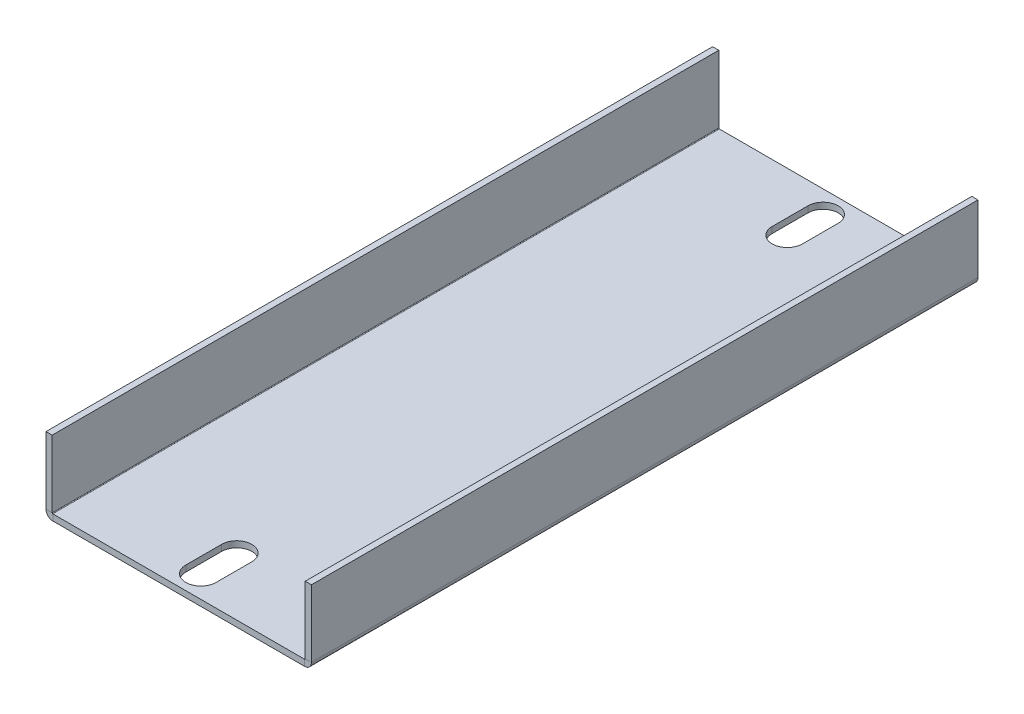
ISO-10303-21;
HEADER;
FILE_DESCRIPTION(('STEP AP214'),'2;1');
FILE_NAME('part.step','',(''),(''),'','','');
FILE_SCHEMA(('AUTOMOTIVE_DESIGN { 1 0 10303 214 1 1 1 1 }'));
ENDSEC;
DATA;
#1=APPLICATION_CONTEXT('core data for automotive mechanical design processes');
#2=APPLICATION_PROTOCOL_DEFINITION('international standard','automotive_design',2000,#1);
#3=PRODUCT_CONTEXT('',#1,'mechanical');
#4=PRODUCT('Part','Part','',(#3));
#5=PRODUCT_RELATED_PRODUCT_CATEGORY('part','',(#4));
#6=PRODUCT_DEFINITION_FORMATION('','',#4);
#7=PRODUCT_DEFINITION_CONTEXT('part definition',#1,'design');
#8=PRODUCT_DEFINITION('design','',#6,#7);
#9=PRODUCT_DEFINITION_SHAPE('','',#8);
#10=(LENGTH_UNIT() NAMED_UNIT(*) SI_UNIT(.MILLI.,.METRE.));
#11=(NAMED_UNIT(*) PLANE_ANGLE_UNIT() SI_UNIT($,.RADIAN.));
#12=(NAMED_UNIT(*) SI_UNIT($,.STERADIAN.) SOLID_ANGLE_UNIT());
#13=UNCERTAINTY_MEASURE_WITH_UNIT(LENGTH_MEASURE(1.E-05),#10,'distance_accuracy_value','');
#14=(GEOMETRIC_REPRESENTATION_CONTEXT(3) GLOBAL_UNCERTAINTY_ASSIGNED_CONTEXT((#13)) GLOBAL_UNIT_ASSIGNED_CONTEXT((#10,
#11,#12)) REPRESENTATION_CONTEXT('',''));
#15=CARTESIAN_POINT('',(0.,0.,0.));
#16=DIRECTION('',(0.,0.,1.));
#17=DIRECTION('',(1.,0.,0.));
#18=AXIS2_PLACEMENT_3D('',#15,#16,#17);
#19=CARTESIAN_POINT('',(-173.097305372499,-0.999999999999994,-11.0415945787923));
#20=DIRECTION('',(0.,1.,0.));
#21=DIRECTION('',(-1.,0.,0.));
#22=AXIS2_PLACEMENT_3D('',#19,#20,#21);
#23=PLANE('',#22);
#24=DIRECTION('',(0.,0.,1.));
#25=VECTOR('',#24,1.);
#26=CARTESIAN_POINT('',(44.,-0.999999999999994,-11.0415945787923));
#27=LINE('',#26,#25);
#28=CARTESIAN_POINT('',(44.,-0.999999999999994,1.));
#29=VERTEX_POINT('',#28);
#30=CARTESIAN_POINT('',(44.,-0.999999999999994,109.));
#31=VERTEX_POINT('',#30);
#32=EDGE_CURVE('E296',#29,#31,#27,.T.);
#33=ORIENTED_EDGE('',*,*,#32,.F.);
#34=DIRECTION('',(1.,0.,0.));
#35=VECTOR('',#34,1.);
#36=CARTESIAN_POINT('',(-173.097305372499,-0.999999999999994,1.));
#37=LINE('',#36,#35);
#38=CARTESIAN_POINT('',(43.,-0.999999999999994,1.));
#39=VERTEX_POINT('',#38);
#40=EDGE_CURVE('E12',#39,#29,#37,.T.);
#41=ORIENTED_EDGE('',*,*,#40,.F.);
#42=DIRECTION('',(0.,0.,1.));
#43=VECTOR('',#42,1.);
#44=CARTESIAN_POINT('',(43.,-0.999999999999994,-11.0415945787923));
#45=LINE('',#44,#43);
#46=CARTESIAN_POINT('',(43.,-0.999999999999994,109.));
#47=VERTEX_POINT('',#46);
#48=EDGE_CURVE('E79',#39,#47,#45,.T.);
#49=ORIENTED_EDGE('',*,*,#48,.T.);
#50=DIRECTION('',(1.,0.,0.));
#51=VECTOR('',#50,1.);
#52=CARTESIAN_POINT('',(-173.097305372499,-0.999999999999994,109.));
#53=LINE('',#52,#51);
#54=EDGE_CURVE('E298',#47,#31,#53,.T.);
#55=ORIENTED_EDGE('',*,*,#54,.T.);
#56=EDGE_LOOP('',(#33,#41,#49,#55));
#57=FACE_BOUND('',#56,.T.);
#58=ADVANCED_FACE('F53',(#57),#23,.T.);
#59=CARTESIAN_POINT('',(-173.097305372499,-13.,109.));
#60=DIRECTION('',(0.,0.,1.));
#61=DIRECTION('',(0.,1.,0.));
#62=AXIS2_PLACEMENT_3D('',#59,#60,#61);
#63=PLANE('',#62);
#64=DIRECTION('',(0.,1.,0.));
#65=VECTOR('',#64,1.);
#66=CARTESIAN_POINT('',(44.,-13.,109.));
#67=LINE('',#66,#65);
#68=CARTESIAN_POINT('',(44.,-11.9,109.));
#69=VERTEX_POINT('',#68);
#70=EDGE_CURVE('E107',#69,#31,#67,.T.);
#71=ORIENTED_EDGE('',*,*,#70,.T.);
#72=ORIENTED_EDGE('',*,*,#54,.F.);
#73=DIRECTION('',(0.,-1.,0.));
#74=VECTOR('',#73,1.);
#75=CARTESIAN_POINT('',(43.,-13.,109.));
#76=LINE('',#75,#74);
#77=CARTESIAN_POINT('',(43.,-11.9,109.));
#78=VERTEX_POINT('',#77);
#79=EDGE_CURVE('E289',#47,#78,#76,.T.);
#80=ORIENTED_EDGE('',*,*,#79,.T.);
#81=DIRECTION('',(1.,0.,0.));
#82=VECTOR('',#81,1.);
#83=CARTESIAN_POINT('',(-173.097305372499,-11.9,109.));
#84=LINE('',#83,#82);
#85=EDGE_CURVE('E278',#78,#69,#84,.T.);
#86=ORIENTED_EDGE('',*,*,#85,.T.);
#87=EDGE_LOOP('',(#71,#72,#80,#86));
#88=FACE_BOUND('',#87,.T.);
#89=ADVANCED_FACE('F288',(#88),#63,.T.);
#90=CARTESIAN_POINT('',(44.,-13.,109.));
#91=DIRECTION('',(-1.,0.,0.));
#92=DIRECTION('',(0.,0.,1.));
#93=AXIS2_PLACEMENT_3D('',#90,#91,#92);
#94=PLANE('',#93);
#95=ORIENTED_EDGE('',*,*,#70,.F.);
#96=DIRECTION('',(0.,0.,-1.));
#97=VECTOR('',#96,1.);
#98=CARTESIAN_POINT('',(44.,-11.9,109.));
#99=LINE('',#98,#97);
#100=CARTESIAN_POINT('',(44.,-11.9,1.));
#101=VERTEX_POINT('',#100);
#102=EDGE_CURVE('E268',#69,#101,#99,.T.);
#103=ORIENTED_EDGE('',*,*,#102,.T.);
#104=DIRECTION('',(0.,1.,0.));
#105=VECTOR('',#104,1.);
#106=CARTESIAN_POINT('',(44.,-13.,1.));
#107=LINE('',#106,#105);
#108=EDGE_CURVE('E277',#101,#29,#107,.T.);
#109=ORIENTED_EDGE('',*,*,#108,.T.);
#110=ORIENTED_EDGE('',*,*,#32,.T.);
#111=EDGE_LOOP('',(#95,#103,#109,#110));
#112=FACE_BOUND('',#111,.T.);
#113=ADVANCED_FACE('F294',(#112),#94,.F.);
#114=CARTESIAN_POINT('',(-173.097305372499,-13.,1.));
#115=DIRECTION('',(0.,0.,-1.));
#116=DIRECTION('',(0.,-1.,0.));
#117=AXIS2_PLACEMENT_3D('',#114,#115,#116);
#118=PLANE('',#117);
#119=ORIENTED_EDGE('',*,*,#108,.F.);
#120=DIRECTION('',(1.,0.,0.));
#121=VECTOR('',#120,1.);
#122=CARTESIAN_POINT('',(-173.097305372499,-11.9,1.));
#123=LINE('',#122,#121);
#124=CARTESIAN_POINT('',(43.,-11.9,1.));
#125=VERTEX_POINT('',#124);
#126=EDGE_CURVE('E407',#125,#101,#123,.T.);
#127=ORIENTED_EDGE('',*,*,#126,.F.);
#128=DIRECTION('',(0.,1.,0.));
#129=VECTOR('',#128,1.);
#130=CARTESIAN_POINT('',(43.,-13.,1.));
#131=LINE('',#130,#129);
#132=EDGE_CURVE('E66',#125,#39,#131,.T.);
#133=ORIENTED_EDGE('',*,*,#132,.T.);
#134=ORIENTED_EDGE('',*,*,#40,.T.);
#135=EDGE_LOOP('',(#119,#127,#133,#134));
#136=FACE_BOUND('',#135,.T.);
#137=ADVANCED_FACE('F414',(#136),#118,.T.);
#138=CARTESIAN_POINT('',(43.,-13.,-11.0415945787923));
#139=DIRECTION('',(-1.,0.,0.));
#140=DIRECTION('',(0.,0.,1.));
#141=AXIS2_PLACEMENT_3D('',#138,#139,#140);
#142=PLANE('',#141);
#143=DIRECTION('',(0.,0.,-1.));
#144=VECTOR('',#143,1.);
#145=CARTESIAN_POINT('',(43.,-11.9,109.));
#146=LINE('',#145,#144);
#147=EDGE_CURVE('E58',#78,#125,#146,.T.);
#148=ORIENTED_EDGE('',*,*,#147,.F.);
#149=ORIENTED_EDGE('',*,*,#79,.F.);
#150=ORIENTED_EDGE('',*,*,#48,.F.);
#151=ORIENTED_EDGE('',*,*,#132,.F.);
#152=EDGE_LOOP('',(#148,#149,#150,#151));
#153=FACE_BOUND('',#152,.T.);
#154=ADVANCED_FACE('F56',(#153),#142,.T.);
#155=CARTESIAN_POINT('',(218.097305372499,-1.,-11.0415945787923));
#156=DIRECTION('',(0.,-1.,0.));
#157=DIRECTION('',(1.,0.,0.));
#158=AXIS2_PLACEMENT_3D('',#155,#156,#157);
#159=PLANE('',#158);
#160=DIRECTION('',(-1.,0.,0.));
#161=VECTOR('',#160,1.);
#162=CARTESIAN_POINT('',(218.097305372499,-1.,1.));
#163=LINE('',#162,#161);
#164=CARTESIAN_POINT('',(1.99999999999998,-1.,1.));
#165=VERTEX_POINT('',#164);
#166=CARTESIAN_POINT('',(0.999999999999973,-1.,1.));
#167=VERTEX_POINT('',#166);
#168=EDGE_CURVE('E623',#165,#167,#163,.T.);
#169=ORIENTED_EDGE('',*,*,#168,.T.);
#170=DIRECTION('',(0.,0.,1.));
#171=VECTOR('',#170,1.);
#172=CARTESIAN_POINT('',(0.999999999999985,-1.,-11.0415945787923));
#173=LINE('',#172,#171);
#174=CARTESIAN_POINT('',(0.999999999999985,-0.999999999999999,109.));
#175=VERTEX_POINT('',#174);
#176=EDGE_CURVE('E379',#167,#175,#173,.T.);
#177=ORIENTED_EDGE('',*,*,#176,.T.);
#178=DIRECTION('',(-1.,0.,0.));
#179=VECTOR('',#178,1.);
#180=CARTESIAN_POINT('',(218.097305372499,-0.999999999999999,109.));
#181=LINE('',#180,#179);
#182=CARTESIAN_POINT('',(1.99999999999997,-0.999999999999997,109.));
#183=VERTEX_POINT('',#182);
#184=EDGE_CURVE('E420',#183,#175,#181,.T.);
#185=ORIENTED_EDGE('',*,*,#184,.F.);
#186=DIRECTION('',(0.,0.,1.));
#187=VECTOR('',#186,1.);
#188=CARTESIAN_POINT('',(1.99999999999998,-1.,-11.0415945787923));
#189=LINE('',#188,#187);
#190=EDGE_CURVE('E120',#165,#183,#189,.T.);
#191=ORIENTED_EDGE('',*,*,#190,.F.);
#192=EDGE_LOOP('',(#169,#177,#185,#191));
#193=FACE_BOUND('',#192,.T.);
#194=ADVANCED_FACE('F663',(#193),#159,.F.);
#195=CARTESIAN_POINT('',(218.097305372499,-13.,1.));
#196=DIRECTION('',(0.,0.,-1.));
#197=DIRECTION('',(0.,1.,0.));
#198=AXIS2_PLACEMENT_3D('',#195,#196,#197);
#199=PLANE('',#198);
#200=DIRECTION('',(0.,1.,0.));
#201=VECTOR('',#200,1.);
#202=CARTESIAN_POINT('',(0.999999999999984,-13.,1.));
#203=LINE('',#202,#201);
#204=CARTESIAN_POINT('',(0.999999999999982,-11.9000000000001,1.));
#205=VERTEX_POINT('',#204);
#206=EDGE_CURVE('E148',#205,#167,#203,.T.);
#207=ORIENTED_EDGE('',*,*,#206,.T.);
#208=ORIENTED_EDGE('',*,*,#168,.F.);
#209=DIRECTION('',(0.,-1.,0.));
#210=VECTOR('',#209,1.);
#211=CARTESIAN_POINT('',(1.99999999999998,-13.,1.));
#212=LINE('',#211,#210);
#213=CARTESIAN_POINT('',(1.99999999999998,-11.9,1.));
#214=VERTEX_POINT('',#213);
#215=EDGE_CURVE('E369',#165,#214,#212,.T.);
#216=ORIENTED_EDGE('',*,*,#215,.T.);
#217=DIRECTION('',(-1.,0.,0.));
#218=VECTOR('',#217,1.);
#219=CARTESIAN_POINT('',(218.097305372499,-11.9,1.));
#220=LINE('',#219,#218);
#221=EDGE_CURVE('E375',#214,#205,#220,.T.);
#222=ORIENTED_EDGE('',*,*,#221,.T.);
#223=EDGE_LOOP('',(#207,#208,#216,#222));
#224=FACE_BOUND('',#223,.T.);
#225=ADVANCED_FACE('F655',(#224),#199,.T.);
#226=CARTESIAN_POINT('',(0.999999999999984,-13.,109.));
#227=DIRECTION('',(1.,0.,0.));
#228=DIRECTION('',(0.,0.,-1.));
#229=AXIS2_PLACEMENT_3D('',#226,#227,#228);
#230=PLANE('',#229);
#231=ORIENTED_EDGE('',*,*,#206,.F.);
#232=DIRECTION('',(0.,0.,1.));
#233=VECTOR('',#232,1.);
#234=CARTESIAN_POINT('',(0.999999999999973,-11.9,1.));
#235=LINE('',#234,#233);
#236=CARTESIAN_POINT('',(0.999999999999984,-11.9,109.));
#237=VERTEX_POINT('',#236);
#238=EDGE_CURVE('E390',#205,#237,#235,.T.);
#239=ORIENTED_EDGE('',*,*,#238,.T.);
#240=DIRECTION('',(0.,1.,0.));
#241=VECTOR('',#240,1.);
#242=CARTESIAN_POINT('',(0.999999999999973,-13.,109.));
#243=LINE('',#242,#241);
#244=EDGE_CURVE('E384',#237,#175,#243,.T.);
#245=ORIENTED_EDGE('',*,*,#244,.T.);
#246=ORIENTED_EDGE('',*,*,#176,.F.);
#247=EDGE_LOOP('',(#231,#239,#245,#246));
#248=FACE_BOUND('',#247,.T.);
#249=ADVANCED_FACE('F659',(#248),#230,.F.);
#250=CARTESIAN_POINT('',(218.097305372499,-13.,109.));
#251=DIRECTION('',(0.,0.,1.));
#252=DIRECTION('',(0.,-1.,0.));
#253=AXIS2_PLACEMENT_3D('',#250,#251,#252);
#254=PLANE('',#253);
#255=ORIENTED_EDGE('',*,*,#244,.F.);
#256=DIRECTION('',(-1.,0.,0.));
#257=VECTOR('',#256,1.);
#258=CARTESIAN_POINT('',(218.097305372499,-11.9,109.));
#259=LINE('',#258,#257);
#260=CARTESIAN_POINT('',(1.99999999999998,-11.9,109.));
#261=VERTEX_POINT('',#260);
#262=EDGE_CURVE('E356',#261,#237,#259,.T.);
#263=ORIENTED_EDGE('',*,*,#262,.F.);
#264=DIRECTION('',(0.,1.,0.));
#265=VECTOR('',#264,1.);
#266=CARTESIAN_POINT('',(1.99999999999997,-13.,109.));
#267=LINE('',#266,#265);
#268=EDGE_CURVE('E389',#261,#183,#267,.T.);
#269=ORIENTED_EDGE('',*,*,#268,.T.);
#270=ORIENTED_EDGE('',*,*,#184,.T.);
#271=EDGE_LOOP('',(#255,#263,#269,#270));
#272=FACE_BOUND('',#271,.T.);
#273=ADVANCED_FACE('F665',(#272),#254,.T.);
#274=CARTESIAN_POINT('',(1.99999999999998,-13.,-11.0415945787923));
#275=DIRECTION('',(1.,0.,0.));
#276=DIRECTION('',(0.,0.,-1.));
#277=AXIS2_PLACEMENT_3D('',#274,#275,#276);
#278=PLANE('',#277);
#279=DIRECTION('',(0.,0.,1.));
#280=VECTOR('',#279,1.);
#281=CARTESIAN_POINT('',(1.99999999999997,-11.9,1.));
#282=LINE('',#281,#280);
#283=EDGE_CURVE('E352',#214,#261,#282,.T.);
#284=ORIENTED_EDGE('',*,*,#283,.F.);
#285=ORIENTED_EDGE('',*,*,#215,.F.);
#286=ORIENTED_EDGE('',*,*,#190,.T.);
#287=ORIENTED_EDGE('',*,*,#268,.F.);
#288=EDGE_LOOP('',(#284,#285,#286,#287));
#289=FACE_BOUND('',#288,.T.);
#290=ADVANCED_FACE('F667',(#289),#278,.T.);
#291=CARTESIAN_POINT('',(0.,-13.,0.));
#292=DIRECTION('',(0.,1.,0.));
#293=DIRECTION('',(0.,0.,1.));
#294=AXIS2_PLACEMENT_3D('',#291,#292,#293);
#295=PLANE('',#294);
#296=CARTESIAN_POINT('',(22.5,-13.,4.6));
#297=DIRECTION('',(0.,-1.,0.));
#298=DIRECTION('',(0.,0.,-1.));
#299=AXIS2_PLACEMENT_3D('',#296,#297,#298);
#300=CIRCLE('',#299,2.45);
#301=CARTESIAN_POINT('',(20.05,-13.,4.6));
#302=VERTEX_POINT('',#301);
#303=CARTESIAN_POINT('',(24.95,-13.,4.60000000000001));
#304=VERTEX_POINT('',#303);
#305=EDGE_CURVE('E505',#302,#304,#300,.T.);
#306=ORIENTED_EDGE('',*,*,#305,.F.);
#307=DIRECTION('',(0.,0.,-1.));
#308=VECTOR('',#307,1.);
#309=CARTESIAN_POINT('',(20.05,-13.,4.6));
#310=LINE('',#309,#308);
#311=CARTESIAN_POINT('',(20.05,-13.,10.4));
#312=VERTEX_POINT('',#311);
#313=EDGE_CURVE('E512',#312,#302,#310,.T.);
#314=ORIENTED_EDGE('',*,*,#313,.F.);
#315=CARTESIAN_POINT('',(22.5,-13.,10.4));
#316=DIRECTION('',(0.,-1.,0.));
#317=DIRECTION('',(0.,0.,-1.));
#318=AXIS2_PLACEMENT_3D('',#315,#316,#317);
#319=CIRCLE('',#318,2.45);
#320=CARTESIAN_POINT('',(24.95,-13.,10.4));
#321=VERTEX_POINT('',#320);
#322=EDGE_CURVE('E526',#321,#312,#319,.T.);
#323=ORIENTED_EDGE('',*,*,#322,.F.);
#324=DIRECTION('',(0.,0.,1.));
#325=VECTOR('',#324,1.);
#326=CARTESIAN_POINT('',(24.95,-13.,4.60000000000001));
#327=LINE('',#326,#325);
#328=EDGE_CURVE('E500',#304,#321,#327,.T.);
#329=ORIENTED_EDGE('',*,*,#328,.F.);
#330=EDGE_LOOP('',(#306,#314,#323,#329));
#331=FACE_BOUND('',#330,.T.);
#332=CARTESIAN_POINT('',(22.5,-13.,105.4));
#333=DIRECTION('',(0.,-1.,0.));
#334=DIRECTION('',(0.,0.,1.));
#335=AXIS2_PLACEMENT_3D('',#332,#333,#334);
#336=CIRCLE('',#335,2.45);
#337=CARTESIAN_POINT('',(24.95,-13.,105.4));
#338=VERTEX_POINT('',#337);
#339=CARTESIAN_POINT('',(20.05,-13.,105.4));
#340=VERTEX_POINT('',#339);
#341=EDGE_CURVE('E486',#338,#340,#336,.T.);
#342=ORIENTED_EDGE('',*,*,#341,.F.);
#343=DIRECTION('',(0.,0.,1.));
#344=VECTOR('',#343,1.);
#345=CARTESIAN_POINT('',(24.95,-13.,105.4));
#346=LINE('',#345,#344);
#347=CARTESIAN_POINT('',(24.95,-13.,99.6));
#348=VERTEX_POINT('',#347);
#349=EDGE_CURVE('E492',#348,#338,#346,.T.);
#350=ORIENTED_EDGE('',*,*,#349,.F.);
#351=CARTESIAN_POINT('',(22.5,-13.,99.6));
#352=DIRECTION('',(0.,-1.,0.));
#353=DIRECTION('',(0.,0.,1.));
#354=AXIS2_PLACEMENT_3D('',#351,#352,#353);
#355=CIRCLE('',#354,2.45);
#356=CARTESIAN_POINT('',(20.05,-13.,99.6));
#357=VERTEX_POINT('',#356);
#358=EDGE_CURVE('E470',#357,#348,#355,.T.);
#359=ORIENTED_EDGE('',*,*,#358,.F.);
#360=DIRECTION('',(0.,0.,-1.));
#361=VECTOR('',#360,1.);
#362=CARTESIAN_POINT('',(20.05,-13.,105.4));
#363=LINE('',#362,#361);
#364=EDGE_CURVE('E465',#340,#357,#363,.T.);
#365=ORIENTED_EDGE('',*,*,#364,.F.);
#366=EDGE_LOOP('',(#342,#350,#359,#365));
#367=FACE_BOUND('',#366,.T.);
#368=DIRECTION('',(0.,0.,-1.));
#369=VECTOR('',#368,1.);
#370=CARTESIAN_POINT('',(42.9,-13.,109.));
#371=LINE('',#370,#369);
#372=CARTESIAN_POINT('',(42.9,-13.,109.));
#373=VERTEX_POINT('',#372);
#374=CARTESIAN_POINT('',(42.9,-13.,1.));
#375=VERTEX_POINT('',#374);
#376=EDGE_CURVE('E441',#373,#375,#371,.T.);
#377=ORIENTED_EDGE('',*,*,#376,.F.);
#378=DIRECTION('',(-1.,0.,0.));
#379=VECTOR('',#378,1.);
#380=CARTESIAN_POINT('',(44.,-13.,109.));
#381=LINE('',#380,#379);
#382=CARTESIAN_POINT('',(2.09999999999998,-13.,109.));
#383=VERTEX_POINT('',#382);
#384=EDGE_CURVE('E481',#373,#383,#381,.T.);
#385=ORIENTED_EDGE('',*,*,#384,.T.);
#386=DIRECTION('',(0.,0.,1.));
#387=VECTOR('',#386,1.);
#388=CARTESIAN_POINT('',(2.09999999999998,-13.,1.));
#389=LINE('',#388,#387);
#390=CARTESIAN_POINT('',(2.09999999999998,-13.,1.));
#391=VERTEX_POINT('',#390);
#392=EDGE_CURVE('E357',#391,#383,#389,.T.);
#393=ORIENTED_EDGE('',*,*,#392,.F.);
#394=DIRECTION('',(1.,0.,0.));
#395=VECTOR('',#394,1.);
#396=CARTESIAN_POINT('',(44.,-13.,1.));
#397=LINE('',#396,#395);
#398=EDGE_CURVE('E487',#391,#375,#397,.T.);
#399=ORIENTED_EDGE('',*,*,#398,.T.);
#400=EDGE_LOOP('',(#377,#385,#393,#399));
#401=FACE_BOUND('',#400,.T.);
#402=ADVANCED_FACE('F547',(#331,#367,#401),#295,.F.);
#403=CARTESIAN_POINT('',(0.,-12.,0.));
#404=DIRECTION('',(0.,1.,0.));
#405=DIRECTION('',(0.,0.,1.));
#406=AXIS2_PLACEMENT_3D('',#403,#404,#405);
#407=PLANE('',#406);
#408=DIRECTION('',(0.,0.,-1.));
#409=VECTOR('',#408,1.);
#410=CARTESIAN_POINT('',(20.05,-12.,4.6));
#411=LINE('',#410,#409);
#412=CARTESIAN_POINT('',(20.05,-12.,10.4));
#413=VERTEX_POINT('',#412);
#414=CARTESIAN_POINT('',(20.05,-12.,4.6));
#415=VERTEX_POINT('',#414);
#416=EDGE_CURVE('E552',#413,#415,#411,.T.);
#417=ORIENTED_EDGE('',*,*,#416,.T.);
#418=CARTESIAN_POINT('',(22.5,-12.,4.6));
#419=DIRECTION('',(0.,-1.,0.));
#420=DIRECTION('',(0.,0.,-1.));
#421=AXIS2_PLACEMENT_3D('',#418,#419,#420);
#422=CIRCLE('',#421,2.45);
#423=CARTESIAN_POINT('',(24.95,-12.,4.60000000000001));
#424=VERTEX_POINT('',#423);
#425=EDGE_CURVE('E539',#415,#424,#422,.T.);
#426=ORIENTED_EDGE('',*,*,#425,.T.);
#427=DIRECTION('',(0.,0.,1.));
#428=VECTOR('',#427,1.);
#429=CARTESIAN_POINT('',(24.95,-12.,4.60000000000001));
#430=LINE('',#429,#428);
#431=CARTESIAN_POINT('',(24.95,-12.,10.4));
#432=VERTEX_POINT('',#431);
#433=EDGE_CURVE('E545',#424,#432,#430,.T.);
#434=ORIENTED_EDGE('',*,*,#433,.T.);
#435=CARTESIAN_POINT('',(22.5,-12.,10.4));
#436=DIRECTION('',(0.,-1.,0.));
#437=DIRECTION('',(0.,0.,-1.));
#438=AXIS2_PLACEMENT_3D('',#435,#436,#437);
#439=CIRCLE('',#438,2.45);
#440=EDGE_CURVE('E590',#432,#413,#439,.T.);
#441=ORIENTED_EDGE('',*,*,#440,.T.);
#442=EDGE_LOOP('',(#417,#426,#434,#441));
#443=FACE_BOUND('',#442,.T.);
#444=DIRECTION('',(0.,0.,1.));
#445=VECTOR('',#444,1.);
#446=CARTESIAN_POINT('',(24.95,-12.,105.4));
#447=LINE('',#446,#445);
#448=CARTESIAN_POINT('',(24.95,-12.,99.6));
#449=VERTEX_POINT('',#448);
#450=CARTESIAN_POINT('',(24.95,-12.,105.4));
#451=VERTEX_POINT('',#450);
#452=EDGE_CURVE('E594',#449,#451,#447,.T.);
#453=ORIENTED_EDGE('',*,*,#452,.T.);
#454=CARTESIAN_POINT('',(22.5,-12.,105.4));
#455=DIRECTION('',(0.,-1.,0.));
#456=DIRECTION('',(0.,0.,1.));
#457=AXIS2_PLACEMENT_3D('',#454,#455,#456);
#458=CIRCLE('',#457,2.45);
#459=CARTESIAN_POINT('',(20.05,-12.,105.4));
#460=VERTEX_POINT('',#459);
#461=EDGE_CURVE('E563',#451,#460,#458,.T.);
#462=ORIENTED_EDGE('',*,*,#461,.T.);
#463=DIRECTION('',(0.,0.,-1.));
#464=VECTOR('',#463,1.);
#465=CARTESIAN_POINT('',(20.05,-12.,105.4));
#466=LINE('',#465,#464);
#467=CARTESIAN_POINT('',(20.05,-12.,99.6));
#468=VERTEX_POINT('',#467);
#469=EDGE_CURVE('E559',#460,#468,#466,.T.);
#470=ORIENTED_EDGE('',*,*,#469,.T.);
#471=CARTESIAN_POINT('',(22.5,-12.,99.6));
#472=DIRECTION('',(0.,-1.,0.));
#473=DIRECTION('',(0.,0.,1.));
#474=AXIS2_PLACEMENT_3D('',#471,#472,#473);
#475=CIRCLE('',#474,2.45);
#476=EDGE_CURVE('E556',#468,#449,#475,.T.);
#477=ORIENTED_EDGE('',*,*,#476,.T.);
#478=EDGE_LOOP('',(#453,#462,#470,#477));
#479=FACE_BOUND('',#478,.T.);
#480=DIRECTION('',(-1.,0.,0.));
#481=VECTOR('',#480,1.);
#482=CARTESIAN_POINT('',(44.,-12.,109.));
#483=LINE('',#482,#481);
#484=CARTESIAN_POINT('',(42.9,-12.,109.));
#485=VERTEX_POINT('',#484);
#486=CARTESIAN_POINT('',(2.09999999999998,-12.,109.));
#487=VERTEX_POINT('',#486);
#488=EDGE_CURVE('E572',#485,#487,#483,.T.);
#489=ORIENTED_EDGE('',*,*,#488,.F.);
#490=DIRECTION('',(0.,0.,-1.));
#491=VECTOR('',#490,1.);
#492=CARTESIAN_POINT('',(42.9,-12.,109.));
#493=LINE('',#492,#491);
#494=CARTESIAN_POINT('',(42.9,-12.,1.));
#495=VERTEX_POINT('',#494);
#496=EDGE_CURVE('E444',#485,#495,#493,.T.);
#497=ORIENTED_EDGE('',*,*,#496,.T.);
#498=DIRECTION('',(1.,0.,0.));
#499=VECTOR('',#498,1.);
#500=CARTESIAN_POINT('',(44.,-12.,1.));
#501=LINE('',#500,#499);
#502=CARTESIAN_POINT('',(2.09999999999998,-12.,1.));
#503=VERTEX_POINT('',#502);
#504=EDGE_CURVE('E342',#503,#495,#501,.T.);
#505=ORIENTED_EDGE('',*,*,#504,.F.);
#506=DIRECTION('',(0.,0.,1.));
#507=VECTOR('',#506,1.);
#508=CARTESIAN_POINT('',(2.09999999999998,-12.,1.));
#509=LINE('',#508,#507);
#510=EDGE_CURVE('E426',#503,#487,#509,.T.);
#511=ORIENTED_EDGE('',*,*,#510,.T.);
#512=EDGE_LOOP('',(#489,#497,#505,#511));
#513=FACE_BOUND('',#512,.T.);
#514=ADVANCED_FACE('F601',(#443,#479,#513),#407,.T.);
#515=CARTESIAN_POINT('',(20.05,-13.,105.4));
#516=DIRECTION('',(1.,0.,0.));
#517=DIRECTION('',(0.,0.,-1.));
#518=AXIS2_PLACEMENT_3D('',#515,#516,#517);
#519=PLANE('',#518);
#520=ORIENTED_EDGE('',*,*,#469,.F.);
#521=DIRECTION('',(0.,1.,0.));
#522=VECTOR('',#521,1.);
#523=CARTESIAN_POINT('',(20.05,-13.,105.4));
#524=LINE('',#523,#522);
#525=EDGE_CURVE('E457',#340,#460,#524,.T.);
#526=ORIENTED_EDGE('',*,*,#525,.F.);
#527=ORIENTED_EDGE('',*,*,#364,.T.);
#528=DIRECTION('',(0.,1.,0.));
#529=VECTOR('',#528,1.);
#530=CARTESIAN_POINT('',(20.05,-13.,99.6));
#531=LINE('',#530,#529);
#532=EDGE_CURVE('E449',#357,#468,#531,.T.);
#533=ORIENTED_EDGE('',*,*,#532,.T.);
#534=EDGE_LOOP('',(#520,#526,#527,#533));
#535=FACE_BOUND('',#534,.T.);
#536=ADVANCED_FACE('F607',(#535),#519,.T.);
#537=CARTESIAN_POINT('',(22.5,-13.,99.6));
#538=DIRECTION('',(0.,1.,0.));
#539=DIRECTION('',(0.,0.,1.));
#540=AXIS2_PLACEMENT_3D('',#537,#538,#539);
#541=CYLINDRICAL_SURFACE('',#540,2.45);
#542=ORIENTED_EDGE('',*,*,#476,.F.);
#543=ORIENTED_EDGE('',*,*,#532,.F.);
#544=ORIENTED_EDGE('',*,*,#358,.T.);
#545=DIRECTION('',(0.,1.,0.));
#546=VECTOR('',#545,1.);
#547=CARTESIAN_POINT('',(24.95,-13.,99.6));
#548=LINE('',#547,#546);
#549=EDGE_CURVE('E453',#348,#449,#548,.T.);
#550=ORIENTED_EDGE('',*,*,#549,.T.);
#551=EDGE_LOOP('',(#542,#543,#544,#550));
#552=FACE_BOUND('',#551,.T.);
#553=ADVANCED_FACE('F615',(#552),#541,.F.);
#554=CARTESIAN_POINT('',(24.95,-13.,105.4));
#555=DIRECTION('',(-1.,0.,0.));
#556=DIRECTION('',(0.,0.,1.));
#557=AXIS2_PLACEMENT_3D('',#554,#555,#556);
#558=PLANE('',#557);
#559=ORIENTED_EDGE('',*,*,#452,.F.);
#560=ORIENTED_EDGE('',*,*,#549,.F.);
#561=ORIENTED_EDGE('',*,*,#349,.T.);
#562=DIRECTION('',(0.,1.,0.));
#563=VECTOR('',#562,1.);
#564=CARTESIAN_POINT('',(24.95,-13.,105.4));
#565=LINE('',#564,#563);
#566=EDGE_CURVE('E461',#338,#451,#565,.T.);
#567=ORIENTED_EDGE('',*,*,#566,.T.);
#568=EDGE_LOOP('',(#559,#560,#561,#567));
#569=FACE_BOUND('',#568,.T.);
#570=ADVANCED_FACE('F618',(#569),#558,.T.);
#571=CARTESIAN_POINT('',(22.5,-13.,105.4));
#572=DIRECTION('',(0.,1.,0.));
#573=DIRECTION('',(0.,0.,1.));
#574=AXIS2_PLACEMENT_3D('',#571,#572,#573);
#575=CYLINDRICAL_SURFACE('',#574,2.45);
#576=ORIENTED_EDGE('',*,*,#461,.F.);
#577=ORIENTED_EDGE('',*,*,#566,.F.);
#578=ORIENTED_EDGE('',*,*,#341,.T.);
#579=ORIENTED_EDGE('',*,*,#525,.T.);
#580=EDGE_LOOP('',(#576,#577,#578,#579));
#581=FACE_BOUND('',#580,.T.);
#582=ADVANCED_FACE('F609',(#581),#575,.F.);
#583=CARTESIAN_POINT('',(22.5,-13.,4.6));
#584=DIRECTION('',(0.,1.,0.));
#585=DIRECTION('',(0.,0.,1.));
#586=AXIS2_PLACEMENT_3D('',#583,#584,#585);
#587=CYLINDRICAL_SURFACE('',#586,2.45);
#588=ORIENTED_EDGE('',*,*,#425,.F.);
#589=DIRECTION('',(0.,1.,0.));
#590=VECTOR('',#589,1.);
#591=CARTESIAN_POINT('',(20.05,-13.,4.6));
#592=LINE('',#591,#590);
#593=EDGE_CURVE('E517',#302,#415,#592,.T.);
#594=ORIENTED_EDGE('',*,*,#593,.F.);
#595=ORIENTED_EDGE('',*,*,#305,.T.);
#596=DIRECTION('',(0.,1.,0.));
#597=VECTOR('',#596,1.);
#598=CARTESIAN_POINT('',(24.95,-13.,4.60000000000001));
#599=LINE('',#598,#597);
#600=EDGE_CURVE('E506',#304,#424,#599,.T.);
#601=ORIENTED_EDGE('',*,*,#600,.T.);
#602=EDGE_LOOP('',(#588,#594,#595,#601));
#603=FACE_BOUND('',#602,.T.);
#604=ADVANCED_FACE('F537',(#603),#587,.F.);
#605=CARTESIAN_POINT('',(24.95,-13.,4.60000000000001));
#606=DIRECTION('',(-1.,0.,0.));
#607=DIRECTION('',(0.,0.,1.));
#608=AXIS2_PLACEMENT_3D('',#605,#606,#607);
#609=PLANE('',#608);
#610=ORIENTED_EDGE('',*,*,#433,.F.);
#611=ORIENTED_EDGE('',*,*,#600,.F.);
#612=ORIENTED_EDGE('',*,*,#328,.T.);
#613=DIRECTION('',(0.,1.,0.));
#614=VECTOR('',#613,1.);
#615=CARTESIAN_POINT('',(24.95,-13.,10.4));
#616=LINE('',#615,#614);
#617=EDGE_CURVE('E523',#321,#432,#616,.T.);
#618=ORIENTED_EDGE('',*,*,#617,.T.);
#619=EDGE_LOOP('',(#610,#611,#612,#618));
#620=FACE_BOUND('',#619,.T.);
#621=ADVANCED_FACE('F544',(#620),#609,.T.);
#622=CARTESIAN_POINT('',(22.5,-13.,10.4));
#623=DIRECTION('',(0.,1.,0.));
#624=DIRECTION('',(0.,0.,1.));
#625=AXIS2_PLACEMENT_3D('',#622,#623,#624);
#626=CYLINDRICAL_SURFACE('',#625,2.45);
#627=ORIENTED_EDGE('',*,*,#440,.F.);
#628=ORIENTED_EDGE('',*,*,#617,.F.);
#629=ORIENTED_EDGE('',*,*,#322,.T.);
#630=DIRECTION('',(0.,1.,0.));
#631=VECTOR('',#630,1.);
#632=CARTESIAN_POINT('',(20.05,-13.,10.4));
#633=LINE('',#632,#631);
#634=EDGE_CURVE('E518',#312,#413,#633,.T.);
#635=ORIENTED_EDGE('',*,*,#634,.T.);
#636=EDGE_LOOP('',(#627,#628,#629,#635));
#637=FACE_BOUND('',#636,.T.);
#638=ADVANCED_FACE('F743',(#637),#626,.F.);
#639=CARTESIAN_POINT('',(20.05,-13.,4.6));
#640=DIRECTION('',(1.,0.,0.));
#641=DIRECTION('',(0.,0.,-1.));
#642=AXIS2_PLACEMENT_3D('',#639,#640,#641);
#643=PLANE('',#642);
#644=ORIENTED_EDGE('',*,*,#416,.F.);
#645=ORIENTED_EDGE('',*,*,#634,.F.);
#646=ORIENTED_EDGE('',*,*,#313,.T.);
#647=ORIENTED_EDGE('',*,*,#593,.T.);
#648=EDGE_LOOP('',(#644,#645,#646,#647));
#649=FACE_BOUND('',#648,.T.);
#650=ADVANCED_FACE('F551',(#649),#643,.T.);
#651=CARTESIAN_POINT('',(44.,217.899458639469,109.));
#652=DIRECTION('',(0.,0.,1.));
#653=DIRECTION('',(1.,0.,0.));
#654=AXIS2_PLACEMENT_3D('',#651,#652,#653);
#655=PLANE('',#654);
#656=ORIENTED_EDGE('',*,*,#384,.F.);
#657=DIRECTION('',(0.,-1.,0.));
#658=VECTOR('',#657,1.);
#659=CARTESIAN_POINT('',(42.9,217.899458639469,109.));
#660=LINE('',#659,#658);
#661=EDGE_CURVE('E284',#485,#373,#660,.T.);
#662=ORIENTED_EDGE('',*,*,#661,.F.);
#663=ORIENTED_EDGE('',*,*,#488,.T.);
#664=DIRECTION('',(0.,-1.,0.));
#665=VECTOR('',#664,1.);
#666=CARTESIAN_POINT('',(2.09999999999998,217.899458639469,109.));
#667=LINE('',#666,#665);
#668=EDGE_CURVE('E438',#487,#383,#667,.T.);
#669=ORIENTED_EDGE('',*,*,#668,.T.);
#670=EDGE_LOOP('',(#656,#662,#663,#669));
#671=FACE_BOUND('',#670,.T.);
#672=ADVANCED_FACE('F646',(#671),#655,.T.);
#673=CARTESIAN_POINT('',(44.,217.899458639469,1.));
#674=DIRECTION('',(0.,0.,-1.));
#675=DIRECTION('',(-1.,0.,0.));
#676=AXIS2_PLACEMENT_3D('',#673,#674,#675);
#677=PLANE('',#676);
#678=ORIENTED_EDGE('',*,*,#398,.F.);
#679=DIRECTION('',(0.,-1.,0.));
#680=VECTOR('',#679,1.);
#681=CARTESIAN_POINT('',(2.09999999999998,217.899458639469,1.));
#682=LINE('',#681,#680);
#683=EDGE_CURVE('E435',#503,#391,#682,.T.);
#684=ORIENTED_EDGE('',*,*,#683,.F.);
#685=ORIENTED_EDGE('',*,*,#504,.T.);
#686=DIRECTION('',(0.,-1.,0.));
#687=VECTOR('',#686,1.);
#688=CARTESIAN_POINT('',(42.9,217.899458639469,1.));
#689=LINE('',#688,#687);
#690=EDGE_CURVE('E409',#495,#375,#689,.T.);
#691=ORIENTED_EDGE('',*,*,#690,.T.);
#692=EDGE_LOOP('',(#678,#684,#685,#691));
#693=FACE_BOUND('',#692,.T.);
#694=ADVANCED_FACE('F640',(#693),#677,.T.);
#695=CARTESIAN_POINT('',(2.09999999999998,-11.9,109.));
#696=DIRECTION('',(0.,0.,1.));
#697=DIRECTION('',(0.,-1.,0.));
#698=AXIS2_PLACEMENT_3D('',#695,#696,#697);
#699=PLANE('',#698);
#700=ORIENTED_EDGE('',*,*,#668,.F.);
#701=CARTESIAN_POINT('',(2.09999999999998,-11.9,109.));
#702=DIRECTION('',(0.,0.,1.));
#703=DIRECTION('',(0.,-1.,0.));
#704=AXIS2_PLACEMENT_3D('',#701,#702,#703);
#705=CIRCLE('',#704,0.1);
#706=EDGE_CURVE('E171',#487,#261,#705,.F.);
#707=ORIENTED_EDGE('',*,*,#706,.T.);
#708=ORIENTED_EDGE('',*,*,#262,.T.);
#709=CARTESIAN_POINT('',(2.09999999999998,-11.9,109.));
#710=DIRECTION('',(0.,0.,1.));
#711=DIRECTION('',(0.,-1.,0.));
#712=AXIS2_PLACEMENT_3D('',#709,#710,#711);
#713=CIRCLE('',#712,1.1);
#714=EDGE_CURVE('E138',#383,#237,#713,.F.);
#715=ORIENTED_EDGE('',*,*,#714,.F.);
#716=EDGE_LOOP('',(#700,#707,#708,#715));
#717=FACE_BOUND('',#716,.T.);
#718=ADVANCED_FACE('F648',(#717),#699,.T.);
#719=CARTESIAN_POINT('',(2.09999999999998,-11.9,1.));
#720=DIRECTION('',(0.,0.,-1.));
#721=DIRECTION('',(0.,1.,0.));
#722=AXIS2_PLACEMENT_3D('',#719,#720,#721);
#723=PLANE('',#722);
#724=ORIENTED_EDGE('',*,*,#221,.F.);
#725=CARTESIAN_POINT('',(2.09999999999998,-11.9,1.));
#726=DIRECTION('',(0.,0.,1.));
#727=DIRECTION('',(0.,-1.,0.));
#728=AXIS2_PLACEMENT_3D('',#725,#726,#727);
#729=CIRCLE('',#728,0.1);
#730=EDGE_CURVE('E343',#214,#503,#729,.T.);
#731=ORIENTED_EDGE('',*,*,#730,.T.);
#732=ORIENTED_EDGE('',*,*,#683,.T.);
#733=CARTESIAN_POINT('',(2.09999999999998,-11.9,1.));
#734=DIRECTION('',(0.,0.,1.));
#735=DIRECTION('',(0.,-1.,0.));
#736=AXIS2_PLACEMENT_3D('',#733,#734,#735);
#737=CIRCLE('',#736,1.1);
#738=EDGE_CURVE('E333',#205,#391,#737,.T.);
#739=ORIENTED_EDGE('',*,*,#738,.F.);
#740=EDGE_LOOP('',(#724,#731,#732,#739));
#741=FACE_BOUND('',#740,.T.);
#742=ADVANCED_FACE('F653',(#741),#723,.T.);
#743=CARTESIAN_POINT('',(2.09999999999998,-11.9,-124.339379286799));
#744=DIRECTION('',(0.,0.,1.));
#745=DIRECTION('',(0.,-1.,0.));
#746=AXIS2_PLACEMENT_3D('',#743,#744,#745);
#747=CYLINDRICAL_SURFACE('',#746,1.1);
#748=ORIENTED_EDGE('',*,*,#738,.T.);
#749=ORIENTED_EDGE('',*,*,#392,.T.);
#750=ORIENTED_EDGE('',*,*,#714,.T.);
#751=ORIENTED_EDGE('',*,*,#238,.F.);
#752=EDGE_LOOP('',(#748,#749,#750,#751));
#753=FACE_BOUND('',#752,.T.);
#754=ADVANCED_FACE('F650',(#753),#747,.T.);
#755=CARTESIAN_POINT('',(2.09999999999998,-11.9,-124.339379286799));
#756=DIRECTION('',(0.,0.,1.));
#757=DIRECTION('',(0.,-1.,0.));
#758=AXIS2_PLACEMENT_3D('',#755,#756,#757);
#759=CYLINDRICAL_SURFACE('',#758,0.1);
#760=ORIENTED_EDGE('',*,*,#730,.F.);
#761=ORIENTED_EDGE('',*,*,#283,.T.);
#762=ORIENTED_EDGE('',*,*,#706,.F.);
#763=ORIENTED_EDGE('',*,*,#510,.F.);
#764=EDGE_LOOP('',(#760,#761,#762,#763));
#765=FACE_BOUND('',#764,.T.);
#766=ADVANCED_FACE('F668',(#765),#759,.F.);
#767=CARTESIAN_POINT('',(42.9,-11.9,1.));
#768=DIRECTION('',(0.,0.,-1.));
#769=DIRECTION('',(-1.,0.,0.));
#770=AXIS2_PLACEMENT_3D('',#767,#768,#769);
#771=PLANE('',#770);
#772=ORIENTED_EDGE('',*,*,#690,.F.);
#773=CARTESIAN_POINT('',(42.9,-11.9,1.));
#774=DIRECTION('',(0.,0.,-1.));
#775=DIRECTION('',(-1.,0.,0.));
#776=AXIS2_PLACEMENT_3D('',#773,#774,#775);
#777=CIRCLE('',#776,0.099999999999998);
#778=EDGE_CURVE('E159',#495,#125,#777,.F.);
#779=ORIENTED_EDGE('',*,*,#778,.T.);
#780=ORIENTED_EDGE('',*,*,#126,.T.);
#781=CARTESIAN_POINT('',(42.9,-11.9,1.));
#782=DIRECTION('',(0.,0.,-1.));
#783=DIRECTION('',(-1.,0.,0.));
#784=AXIS2_PLACEMENT_3D('',#781,#782,#783);
#785=CIRCLE('',#784,1.1);
#786=EDGE_CURVE('E99',#375,#101,#785,.F.);
#787=ORIENTED_EDGE('',*,*,#786,.F.);
#788=EDGE_LOOP('',(#772,#779,#780,#787));
#789=FACE_BOUND('',#788,.T.);
#790=ADVANCED_FACE('F405',(#789),#771,.T.);
#791=CARTESIAN_POINT('',(42.9,-11.9,109.));
#792=DIRECTION('',(0.,0.,1.));
#793=DIRECTION('',(1.,0.,0.));
#794=AXIS2_PLACEMENT_3D('',#791,#792,#793);
#795=PLANE('',#794);
#796=ORIENTED_EDGE('',*,*,#85,.F.);
#797=CARTESIAN_POINT('',(42.9,-11.9,109.));
#798=DIRECTION('',(0.,0.,-1.));
#799=DIRECTION('',(-1.,0.,0.));
#800=AXIS2_PLACEMENT_3D('',#797,#798,#799);
#801=CIRCLE('',#800,0.099999999999998);
#802=EDGE_CURVE('E397',#78,#485,#801,.T.);
#803=ORIENTED_EDGE('',*,*,#802,.T.);
#804=ORIENTED_EDGE('',*,*,#661,.T.);
#805=CARTESIAN_POINT('',(42.9,-11.9,109.));
#806=DIRECTION('',(0.,0.,-1.));
#807=DIRECTION('',(-1.,0.,0.));
#808=AXIS2_PLACEMENT_3D('',#805,#806,#807);
#809=CIRCLE('',#808,1.1);
#810=EDGE_CURVE('E271',#69,#373,#809,.T.);
#811=ORIENTED_EDGE('',*,*,#810,.F.);
#812=EDGE_LOOP('',(#796,#803,#804,#811));
#813=FACE_BOUND('',#812,.T.);
#814=ADVANCED_FACE('F281',(#813),#795,.T.);
#815=CARTESIAN_POINT('',(42.9,-11.9,230.032598914507));
#816=DIRECTION('',(0.,0.,-1.));
#817=DIRECTION('',(-1.,0.,0.));
#818=AXIS2_PLACEMENT_3D('',#815,#816,#817);
#819=CYLINDRICAL_SURFACE('',#818,1.1);
#820=ORIENTED_EDGE('',*,*,#810,.T.);
#821=ORIENTED_EDGE('',*,*,#376,.T.);
#822=ORIENTED_EDGE('',*,*,#786,.T.);
#823=ORIENTED_EDGE('',*,*,#102,.F.);
#824=EDGE_LOOP('',(#820,#821,#822,#823));
#825=FACE_BOUND('',#824,.T.);
#826=ADVANCED_FACE('F270',(#825),#819,.T.);
#827=CARTESIAN_POINT('',(42.9,-11.9,230.032598914507));
#828=DIRECTION('',(0.,0.,-1.));
#829=DIRECTION('',(-1.,0.,0.));
#830=AXIS2_PLACEMENT_3D('',#827,#828,#829);
#831=CYLINDRICAL_SURFACE('',#830,0.099999999999998);
#832=ORIENTED_EDGE('',*,*,#802,.F.);
#833=ORIENTED_EDGE('',*,*,#147,.T.);
#834=ORIENTED_EDGE('',*,*,#778,.F.);
#835=ORIENTED_EDGE('',*,*,#496,.F.);
#836=EDGE_LOOP('',(#832,#833,#834,#835));
#837=FACE_BOUND('',#836,.T.);
#838=ADVANCED_FACE('F644',(#837),#831,.F.);
#839=CLOSED_SHELL('',(#58,#89,#113,#137,#154,#194,#225,#249,#273,#290,#402,#514,#536,#553,#570,
#582,#604,#621,#638,#650,#672,#694,#718,#742,#754,#766,#790,#814,#826,#838));
#840=MANIFOLD_SOLID_BREP('B2',#839);
#841=ADVANCED_BREP_SHAPE_REPRESENTATION('',(#18,#840),#14);
#842=SHAPE_DEFINITION_REPRESENTATION(#9,#841);
ENDSEC;
END-ISO-10303-21;
